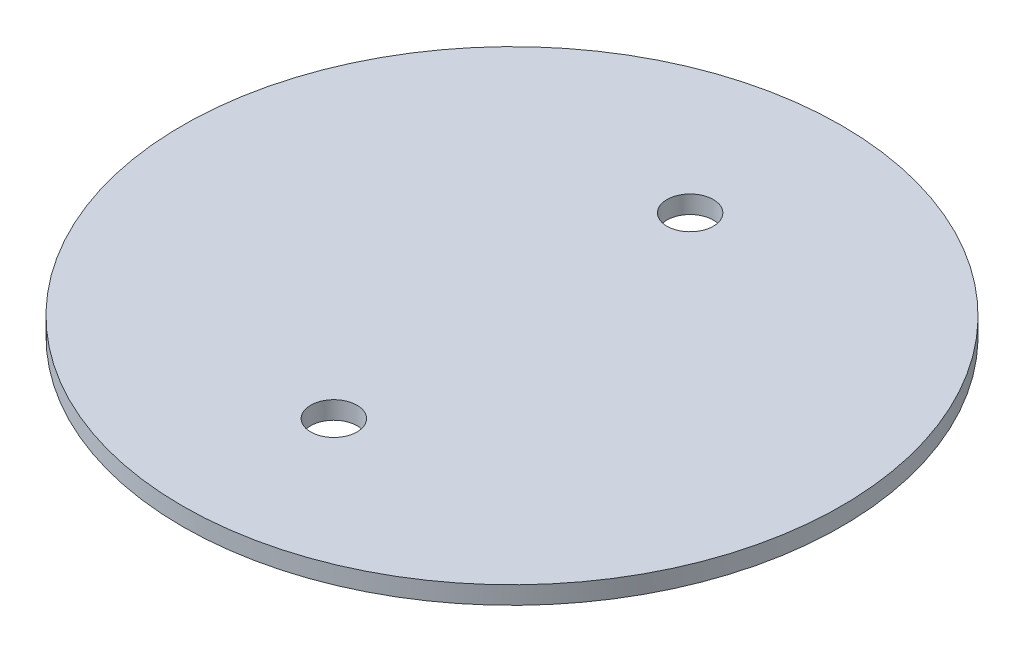
ISO-10303-21;
HEADER;
FILE_DESCRIPTION(('STEP AP214'),'2;1');
FILE_NAME('part.step','',(''),(''),'','','');
FILE_SCHEMA(('AUTOMOTIVE_DESIGN { 1 0 10303 214 1 1 1 1 }'));
ENDSEC;
DATA;
#1=APPLICATION_CONTEXT('core data for automotive mechanical design processes');
#2=APPLICATION_PROTOCOL_DEFINITION('international standard','automotive_design',2000,#1);
#3=PRODUCT_CONTEXT('',#1,'mechanical');
#4=PRODUCT('Part','Part','',(#3));
#5=PRODUCT_RELATED_PRODUCT_CATEGORY('part','',(#4));
#6=PRODUCT_DEFINITION_FORMATION('','',#4);
#7=PRODUCT_DEFINITION_CONTEXT('part definition',#1,'design');
#8=PRODUCT_DEFINITION('design','',#6,#7);
#9=PRODUCT_DEFINITION_SHAPE('','',#8);
#10=(LENGTH_UNIT() NAMED_UNIT(*) SI_UNIT(.MILLI.,.METRE.));
#11=(NAMED_UNIT(*) PLANE_ANGLE_UNIT() SI_UNIT($,.RADIAN.));
#12=(NAMED_UNIT(*) SI_UNIT($,.STERADIAN.) SOLID_ANGLE_UNIT());
#13=UNCERTAINTY_MEASURE_WITH_UNIT(LENGTH_MEASURE(1.E-05),#10,'distance_accuracy_value','');
#14=(GEOMETRIC_REPRESENTATION_CONTEXT(3) GLOBAL_UNCERTAINTY_ASSIGNED_CONTEXT((#13)) GLOBAL_UNIT_ASSIGNED_CONTEXT((#10,
#11,#12)) REPRESENTATION_CONTEXT('',''));
#15=CARTESIAN_POINT('',(0.,0.,0.));
#16=DIRECTION('',(0.,0.,1.));
#17=DIRECTION('',(1.,0.,0.));
#18=AXIS2_PLACEMENT_3D('',#15,#16,#17);
#19=CARTESIAN_POINT('',(0.,2.,0.));
#20=DIRECTION('',(0.,-1.,0.));
#21=DIRECTION('',(0.,0.,-1.));
#22=AXIS2_PLACEMENT_3D('',#19,#20,#21);
#23=CYLINDRICAL_SURFACE('',#22,37.);
#24=CARTESIAN_POINT('',(0.,2.,0.));
#25=DIRECTION('',(0.,1.,0.));
#26=DIRECTION('',(0.,0.,1.));
#27=AXIS2_PLACEMENT_3D('',#24,#25,#26);
#28=CIRCLE('',#27,37.);
#29=CARTESIAN_POINT('',(0.,2.,37.));
#30=VERTEX_POINT('',#29);
#31=EDGE_CURVE('E10',#30,#30,#28,.T.);
#32=ORIENTED_EDGE('',*,*,#31,.F.);
#33=EDGE_LOOP('',(#32));
#34=FACE_BOUND('',#33,.T.);
#35=CARTESIAN_POINT('',(0.,0.,0.));
#36=DIRECTION('',(0.,1.,0.));
#37=DIRECTION('',(0.,0.,1.));
#38=AXIS2_PLACEMENT_3D('',#35,#36,#37);
#39=CIRCLE('',#38,37.);
#40=CARTESIAN_POINT('',(0.,0.,37.));
#41=VERTEX_POINT('',#40);
#42=EDGE_CURVE('E45',#41,#41,#39,.T.);
#43=ORIENTED_EDGE('',*,*,#42,.T.);
#44=EDGE_LOOP('',(#43));
#45=FACE_BOUND('',#44,.T.);
#46=ADVANCED_FACE('F37',(#34,#45),#23,.T.);
#47=CARTESIAN_POINT('',(0.,2.,0.));
#48=DIRECTION('',(0.,1.,0.));
#49=DIRECTION('',(0.,0.,1.));
#50=AXIS2_PLACEMENT_3D('',#47,#48,#49);
#51=PLANE('',#50);
#52=CARTESIAN_POINT('',(0.,2.,-20.));
#53=DIRECTION('',(0.,1.,0.));
#54=DIRECTION('',(0.,0.,1.));
#55=AXIS2_PLACEMENT_3D('',#52,#53,#54);
#56=CIRCLE('',#55,2.6);
#57=CARTESIAN_POINT('',(0.,2.,-17.4));
#58=VERTEX_POINT('',#57);
#59=EDGE_CURVE('E58',#58,#58,#56,.T.);
#60=ORIENTED_EDGE('',*,*,#59,.F.);
#61=EDGE_LOOP('',(#60));
#62=FACE_BOUND('',#61,.T.);
#63=CARTESIAN_POINT('',(0.,2.,20.));
#64=DIRECTION('',(0.,1.,0.));
#65=DIRECTION('',(0.,0.,-1.));
#66=AXIS2_PLACEMENT_3D('',#63,#64,#65);
#67=CIRCLE('',#66,2.6);
#68=CARTESIAN_POINT('',(0.,2.,17.4));
#69=VERTEX_POINT('',#68);
#70=EDGE_CURVE('E53',#69,#69,#67,.T.);
#71=ORIENTED_EDGE('',*,*,#70,.F.);
#72=EDGE_LOOP('',(#71));
#73=FACE_BOUND('',#72,.T.);
#74=ORIENTED_EDGE('',*,*,#31,.T.);
#75=EDGE_LOOP('',(#74));
#76=FACE_BOUND('',#75,.T.);
#77=ADVANCED_FACE('F74',(#62,#73,#76),#51,.T.);
#78=CARTESIAN_POINT('',(0.,0.,0.));
#79=DIRECTION('',(0.,1.,0.));
#80=DIRECTION('',(0.,0.,1.));
#81=AXIS2_PLACEMENT_3D('',#78,#79,#80);
#82=PLANE('',#81);
#83=CARTESIAN_POINT('',(0.,0.,-20.));
#84=DIRECTION('',(0.,1.,0.));
#85=DIRECTION('',(0.,0.,1.));
#86=AXIS2_PLACEMENT_3D('',#83,#84,#85);
#87=CIRCLE('',#86,2.6);
#88=CARTESIAN_POINT('',(0.,0.,-17.4));
#89=VERTEX_POINT('',#88);
#90=EDGE_CURVE('E40',#89,#89,#87,.T.);
#91=ORIENTED_EDGE('',*,*,#90,.T.);
#92=EDGE_LOOP('',(#91));
#93=FACE_BOUND('',#92,.T.);
#94=CARTESIAN_POINT('',(0.,0.,20.));
#95=DIRECTION('',(0.,1.,0.));
#96=DIRECTION('',(0.,0.,1.));
#97=AXIS2_PLACEMENT_3D('',#94,#95,#96);
#98=CIRCLE('',#97,2.6);
#99=CARTESIAN_POINT('',(0.,0.,22.6));
#100=VERTEX_POINT('',#99);
#101=EDGE_CURVE('E55',#100,#100,#98,.T.);
#102=ORIENTED_EDGE('',*,*,#101,.T.);
#103=EDGE_LOOP('',(#102));
#104=FACE_BOUND('',#103,.T.);
#105=ORIENTED_EDGE('',*,*,#42,.F.);
#106=EDGE_LOOP('',(#105));
#107=FACE_BOUND('',#106,.T.);
#108=ADVANCED_FACE('F76',(#93,#104,#107),#82,.F.);
#109=CARTESIAN_POINT('',(0.,-1.,20.));
#110=DIRECTION('',(0.,1.,0.));
#111=DIRECTION('',(0.,0.,1.));
#112=AXIS2_PLACEMENT_3D('',#109,#110,#111);
#113=CYLINDRICAL_SURFACE('',#112,2.6);
#114=ORIENTED_EDGE('',*,*,#70,.T.);
#115=EDGE_LOOP('',(#114));
#116=FACE_BOUND('',#115,.T.);
#117=ORIENTED_EDGE('',*,*,#101,.F.);
#118=EDGE_LOOP('',(#117));
#119=FACE_BOUND('',#118,.T.);
#120=ADVANCED_FACE('F71',(#116,#119),#113,.F.);
#121=CARTESIAN_POINT('',(0.,-1.,-20.));
#122=DIRECTION('',(0.,1.,0.));
#123=DIRECTION('',(0.,0.,1.));
#124=AXIS2_PLACEMENT_3D('',#121,#122,#123);
#125=CYLINDRICAL_SURFACE('',#124,2.6);
#126=ORIENTED_EDGE('',*,*,#59,.T.);
#127=EDGE_LOOP('',(#126));
#128=FACE_BOUND('',#127,.T.);
#129=ORIENTED_EDGE('',*,*,#90,.F.);
#130=EDGE_LOOP('',(#129));
#131=FACE_BOUND('',#130,.T.);
#132=ADVANCED_FACE('F88',(#128,#131),#125,.F.);
#133=CLOSED_SHELL('',(#46,#77,#108,#120,#132));
#134=MANIFOLD_SOLID_BREP('B2',#133);
#135=ADVANCED_BREP_SHAPE_REPRESENTATION('',(#18,#134),#14);
#136=SHAPE_DEFINITION_REPRESENTATION(#9,#135);
ENDSEC;
END-ISO-10303-21;
